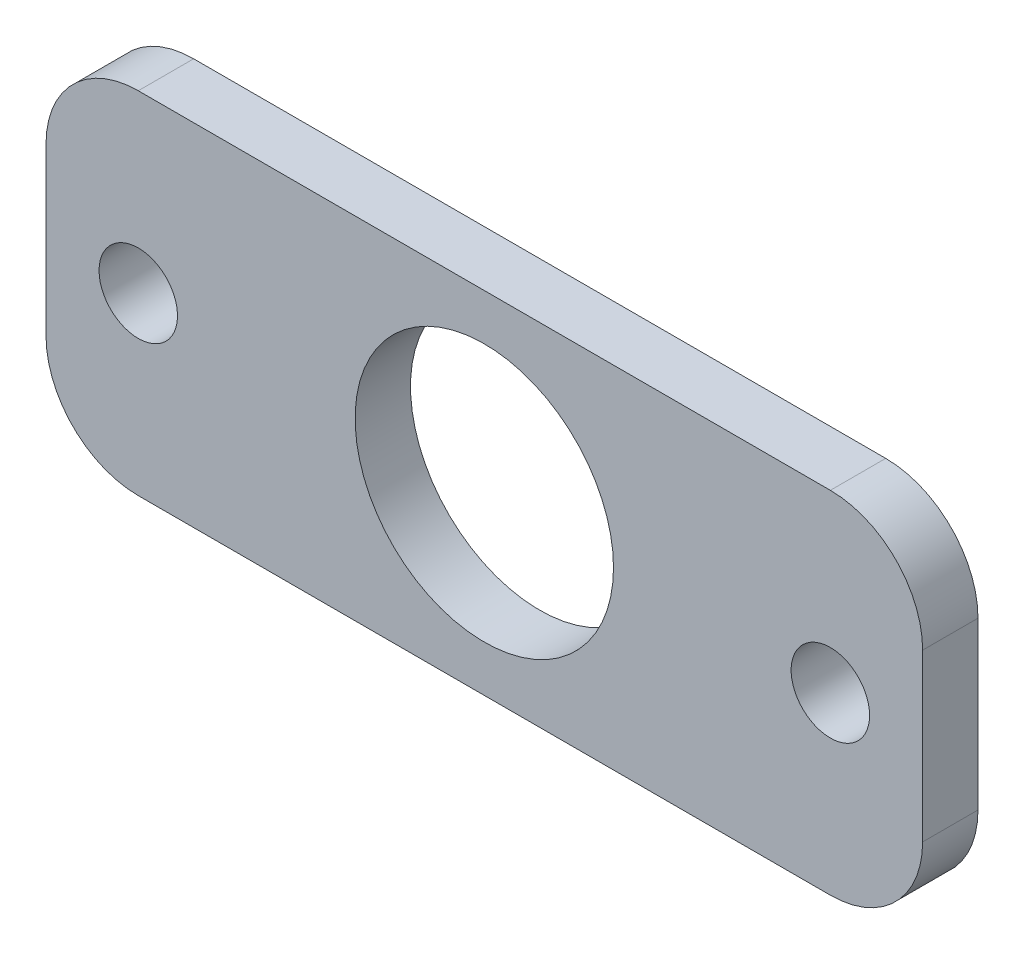
ISO-10303-21;
HEADER;
FILE_DESCRIPTION(('STEP AP214'),'2;1');
FILE_NAME('part.step','',(''),(''),'','','');
FILE_SCHEMA(('AUTOMOTIVE_DESIGN { 1 0 10303 214 1 1 1 1 }'));
ENDSEC;
DATA;
#1=APPLICATION_CONTEXT('core data for automotive mechanical design processes');
#2=APPLICATION_PROTOCOL_DEFINITION('international standard','automotive_design',2000,#1);
#3=PRODUCT_CONTEXT('',#1,'mechanical');
#4=PRODUCT('Part','Part','',(#3));
#5=PRODUCT_RELATED_PRODUCT_CATEGORY('part','',(#4));
#6=PRODUCT_DEFINITION_FORMATION('','',#4);
#7=PRODUCT_DEFINITION_CONTEXT('part definition',#1,'design');
#8=PRODUCT_DEFINITION('design','',#6,#7);
#9=PRODUCT_DEFINITION_SHAPE('','',#8);
#10=(LENGTH_UNIT() NAMED_UNIT(*) SI_UNIT(.MILLI.,.METRE.));
#11=(NAMED_UNIT(*) PLANE_ANGLE_UNIT() SI_UNIT($,.RADIAN.));
#12=(NAMED_UNIT(*) SI_UNIT($,.STERADIAN.) SOLID_ANGLE_UNIT());
#13=UNCERTAINTY_MEASURE_WITH_UNIT(LENGTH_MEASURE(1.E-05),#10,'distance_accuracy_value','');
#14=(GEOMETRIC_REPRESENTATION_CONTEXT(3) GLOBAL_UNCERTAINTY_ASSIGNED_CONTEXT((#13)) GLOBAL_UNIT_ASSIGNED_CONTEXT((#10,
#11,#12)) REPRESENTATION_CONTEXT('',''));
#15=CARTESIAN_POINT('',(0.,0.,0.));
#16=DIRECTION('',(0.,0.,1.));
#17=DIRECTION('',(1.,0.,0.));
#18=AXIS2_PLACEMENT_3D('',#15,#16,#17);
#19=CARTESIAN_POINT('',(0.,0.,6.));
#20=DIRECTION('',(0.,0.,-1.));
#21=DIRECTION('',(-1.,0.,0.));
#22=AXIS2_PLACEMENT_3D('',#19,#20,#21);
#23=PLANE('',#22);
#24=DIRECTION('',(0.,1.,0.));
#25=VECTOR('',#24,1.);
#26=CARTESIAN_POINT('',(399.,0.,6.));
#27=LINE('',#26,#25);
#28=CARTESIAN_POINT('',(399.,-28.,6.));
#29=VERTEX_POINT('',#28);
#30=CARTESIAN_POINT('',(399.,-9.99999999999998,6.));
#31=VERTEX_POINT('',#30);
#32=EDGE_CURVE('E148',#29,#31,#27,.T.);
#33=ORIENTED_EDGE('',*,*,#32,.T.);
#34=CARTESIAN_POINT('',(389.,-9.99999999999998,6.));
#35=DIRECTION('',(0.,0.,-1.));
#36=DIRECTION('',(-1.,0.,0.));
#37=AXIS2_PLACEMENT_3D('',#34,#35,#36);
#38=CIRCLE('',#37,10.);
#39=CARTESIAN_POINT('',(389.,0.,6.));
#40=VERTEX_POINT('',#39);
#41=EDGE_CURVE('E172',#31,#40,#38,.F.);
#42=ORIENTED_EDGE('',*,*,#41,.T.);
#43=DIRECTION('',(-1.,0.,0.));
#44=VECTOR('',#43,1.);
#45=CARTESIAN_POINT('',(399.,0.,6.));
#46=LINE('',#45,#44);
#47=CARTESIAN_POINT('',(314.,0.,6.));
#48=VERTEX_POINT('',#47);
#49=EDGE_CURVE('E124',#40,#48,#46,.T.);
#50=ORIENTED_EDGE('',*,*,#49,.T.);
#51=CARTESIAN_POINT('',(314.,-9.99999999999998,6.));
#52=DIRECTION('',(0.,0.,-1.));
#53=DIRECTION('',(-1.,0.,0.));
#54=AXIS2_PLACEMENT_3D('',#51,#52,#53);
#55=CIRCLE('',#54,10.);
#56=CARTESIAN_POINT('',(304.,-9.99999999999998,6.));
#57=VERTEX_POINT('',#56);
#58=EDGE_CURVE('E164',#48,#57,#55,.F.);
#59=ORIENTED_EDGE('',*,*,#58,.T.);
#60=DIRECTION('',(0.,-1.,0.));
#61=VECTOR('',#60,1.);
#62=CARTESIAN_POINT('',(304.,0.,6.));
#63=LINE('',#62,#61);
#64=CARTESIAN_POINT('',(304.,-28.,6.));
#65=VERTEX_POINT('',#64);
#66=EDGE_CURVE('E188',#57,#65,#63,.T.);
#67=ORIENTED_EDGE('',*,*,#66,.T.);
#68=CARTESIAN_POINT('',(314.,-28.,6.));
#69=DIRECTION('',(0.,0.,-1.));
#70=DIRECTION('',(-1.,0.,0.));
#71=AXIS2_PLACEMENT_3D('',#68,#69,#70);
#72=CIRCLE('',#71,10.);
#73=CARTESIAN_POINT('',(314.,-38.,6.));
#74=VERTEX_POINT('',#73);
#75=EDGE_CURVE('E59',#65,#74,#72,.F.);
#76=ORIENTED_EDGE('',*,*,#75,.T.);
#77=DIRECTION('',(1.,0.,0.));
#78=VECTOR('',#77,1.);
#79=CARTESIAN_POINT('',(399.,-38.,6.));
#80=LINE('',#79,#78);
#81=CARTESIAN_POINT('',(389.,-38.,6.));
#82=VERTEX_POINT('',#81);
#83=EDGE_CURVE('E150',#74,#82,#80,.T.);
#84=ORIENTED_EDGE('',*,*,#83,.T.);
#85=CARTESIAN_POINT('',(389.,-28.,6.));
#86=DIRECTION('',(0.,0.,-1.));
#87=DIRECTION('',(-1.,0.,0.));
#88=AXIS2_PLACEMENT_3D('',#85,#86,#87);
#89=CIRCLE('',#88,10.);
#90=EDGE_CURVE('E169',#82,#29,#89,.F.);
#91=ORIENTED_EDGE('',*,*,#90,.T.);
#92=EDGE_LOOP('',(#33,#42,#50,#59,#67,#76,#84,#91));
#93=FACE_BOUND('',#92,.T.);
#94=CARTESIAN_POINT('',(351.5,-19.,6.));
#95=DIRECTION('',(0.,0.,1.));
#96=DIRECTION('',(1.,0.,0.));
#97=AXIS2_PLACEMENT_3D('',#94,#95,#96);
#98=CIRCLE('',#97,14.);
#99=CARTESIAN_POINT('',(365.5,-19.,6.));
#100=VERTEX_POINT('',#99);
#101=EDGE_CURVE('E142',#100,#100,#98,.T.);
#102=ORIENTED_EDGE('',*,*,#101,.F.);
#103=EDGE_LOOP('',(#102));
#104=FACE_BOUND('',#103,.T.);
#105=CARTESIAN_POINT('',(389.,-19.,6.));
#106=DIRECTION('',(0.,0.,1.));
#107=DIRECTION('',(1.,0.,0.));
#108=AXIS2_PLACEMENT_3D('',#105,#106,#107);
#109=CIRCLE('',#108,4.24999999999995);
#110=CARTESIAN_POINT('',(393.25,-19.,6.));
#111=VERTEX_POINT('',#110);
#112=EDGE_CURVE('E209',#111,#111,#109,.T.);
#113=ORIENTED_EDGE('',*,*,#112,.F.);
#114=EDGE_LOOP('',(#113));
#115=FACE_BOUND('',#114,.T.);
#116=CARTESIAN_POINT('',(314.,-19.,6.));
#117=DIRECTION('',(0.,0.,1.));
#118=DIRECTION('',(-1.,0.,0.));
#119=AXIS2_PLACEMENT_3D('',#116,#117,#118);
#120=CIRCLE('',#119,4.24999999999995);
#121=CARTESIAN_POINT('',(309.75,-19.,6.));
#122=VERTEX_POINT('',#121);
#123=EDGE_CURVE('E217',#122,#122,#120,.T.);
#124=ORIENTED_EDGE('',*,*,#123,.F.);
#125=EDGE_LOOP('',(#124));
#126=FACE_BOUND('',#125,.T.);
#127=ADVANCED_FACE('F36',(#93,#104,#115,#126),#23,.F.);
#128=CARTESIAN_POINT('',(0.,0.,0.));
#129=DIRECTION('',(0.,0.,-1.));
#130=DIRECTION('',(-1.,0.,0.));
#131=AXIS2_PLACEMENT_3D('',#128,#129,#130);
#132=PLANE('',#131);
#133=CARTESIAN_POINT('',(389.,-19.,0.));
#134=DIRECTION('',(0.,0.,1.));
#135=DIRECTION('',(1.,0.,0.));
#136=AXIS2_PLACEMENT_3D('',#133,#134,#135);
#137=CIRCLE('',#136,4.24999999999995);
#138=CARTESIAN_POINT('',(393.25,-19.,0.));
#139=VERTEX_POINT('',#138);
#140=EDGE_CURVE('E213',#139,#139,#137,.T.);
#141=ORIENTED_EDGE('',*,*,#140,.T.);
#142=EDGE_LOOP('',(#141));
#143=FACE_BOUND('',#142,.T.);
#144=DIRECTION('',(-1.,0.,0.));
#145=VECTOR('',#144,1.);
#146=CARTESIAN_POINT('',(399.,0.,0.));
#147=LINE('',#146,#145);
#148=CARTESIAN_POINT('',(389.,0.,0.));
#149=VERTEX_POINT('',#148);
#150=CARTESIAN_POINT('',(314.,0.,0.));
#151=VERTEX_POINT('',#150);
#152=EDGE_CURVE('E121',#149,#151,#147,.T.);
#153=ORIENTED_EDGE('',*,*,#152,.F.);
#154=CARTESIAN_POINT('',(389.,-9.99999999999998,0.));
#155=DIRECTION('',(0.,0.,-1.));
#156=DIRECTION('',(-1.,0.,0.));
#157=AXIS2_PLACEMENT_3D('',#154,#155,#156);
#158=CIRCLE('',#157,10.);
#159=CARTESIAN_POINT('',(399.,-9.99999999999998,0.));
#160=VERTEX_POINT('',#159);
#161=EDGE_CURVE('E103',#149,#160,#158,.T.);
#162=ORIENTED_EDGE('',*,*,#161,.T.);
#163=DIRECTION('',(0.,1.,0.));
#164=VECTOR('',#163,1.);
#165=CARTESIAN_POINT('',(399.,0.,0.));
#166=LINE('',#165,#164);
#167=CARTESIAN_POINT('',(399.,-28.,0.));
#168=VERTEX_POINT('',#167);
#169=EDGE_CURVE('E134',#168,#160,#166,.T.);
#170=ORIENTED_EDGE('',*,*,#169,.F.);
#171=CARTESIAN_POINT('',(389.,-28.,0.));
#172=DIRECTION('',(0.,0.,-1.));
#173=DIRECTION('',(-1.,0.,0.));
#174=AXIS2_PLACEMENT_3D('',#171,#172,#173);
#175=CIRCLE('',#174,10.);
#176=CARTESIAN_POINT('',(389.,-38.,0.));
#177=VERTEX_POINT('',#176);
#178=EDGE_CURVE('E115',#168,#177,#175,.T.);
#179=ORIENTED_EDGE('',*,*,#178,.T.);
#180=DIRECTION('',(1.,0.,0.));
#181=VECTOR('',#180,1.);
#182=CARTESIAN_POINT('',(399.,-38.,0.));
#183=LINE('',#182,#181);
#184=CARTESIAN_POINT('',(314.,-38.,0.));
#185=VERTEX_POINT('',#184);
#186=EDGE_CURVE('E140',#185,#177,#183,.T.);
#187=ORIENTED_EDGE('',*,*,#186,.F.);
#188=CARTESIAN_POINT('',(314.,-28.,0.));
#189=DIRECTION('',(0.,0.,-1.));
#190=DIRECTION('',(-1.,0.,0.));
#191=AXIS2_PLACEMENT_3D('',#188,#189,#190);
#192=CIRCLE('',#191,10.);
#193=CARTESIAN_POINT('',(304.,-28.,0.));
#194=VERTEX_POINT('',#193);
#195=EDGE_CURVE('E154',#185,#194,#192,.T.);
#196=ORIENTED_EDGE('',*,*,#195,.T.);
#197=DIRECTION('',(0.,-1.,0.));
#198=VECTOR('',#197,1.);
#199=CARTESIAN_POINT('',(304.,0.,0.));
#200=LINE('',#199,#198);
#201=CARTESIAN_POINT('',(304.,-9.99999999999998,0.));
#202=VERTEX_POINT('',#201);
#203=EDGE_CURVE('E133',#202,#194,#200,.T.);
#204=ORIENTED_EDGE('',*,*,#203,.F.);
#205=CARTESIAN_POINT('',(314.,-9.99999999999998,0.));
#206=DIRECTION('',(0.,0.,-1.));
#207=DIRECTION('',(-1.,0.,0.));
#208=AXIS2_PLACEMENT_3D('',#205,#206,#207);
#209=CIRCLE('',#208,10.);
#210=EDGE_CURVE('E126',#202,#151,#209,.T.);
#211=ORIENTED_EDGE('',*,*,#210,.T.);
#212=EDGE_LOOP('',(#153,#162,#170,#179,#187,#196,#204,#211));
#213=FACE_BOUND('',#212,.T.);
#214=CARTESIAN_POINT('',(351.5,-19.,0.));
#215=DIRECTION('',(0.,0.,1.));
#216=DIRECTION('',(1.,0.,0.));
#217=AXIS2_PLACEMENT_3D('',#214,#215,#216);
#218=CIRCLE('',#217,14.);
#219=CARTESIAN_POINT('',(365.5,-19.,0.));
#220=VERTEX_POINT('',#219);
#221=EDGE_CURVE('E205',#220,#220,#218,.T.);
#222=ORIENTED_EDGE('',*,*,#221,.T.);
#223=EDGE_LOOP('',(#222));
#224=FACE_BOUND('',#223,.T.);
#225=CARTESIAN_POINT('',(314.,-19.,0.));
#226=DIRECTION('',(0.,0.,1.));
#227=DIRECTION('',(-1.,0.,0.));
#228=AXIS2_PLACEMENT_3D('',#225,#226,#227);
#229=CIRCLE('',#228,4.24999999999995);
#230=CARTESIAN_POINT('',(309.75,-19.,0.));
#231=VERTEX_POINT('',#230);
#232=EDGE_CURVE('E220',#231,#231,#229,.T.);
#233=ORIENTED_EDGE('',*,*,#232,.T.);
#234=EDGE_LOOP('',(#233));
#235=FACE_BOUND('',#234,.T.);
#236=ADVANCED_FACE('F129',(#143,#213,#224,#235),#132,.T.);
#237=CARTESIAN_POINT('',(399.,0.,6.));
#238=DIRECTION('',(-1.,0.,0.));
#239=DIRECTION('',(0.,0.,1.));
#240=AXIS2_PLACEMENT_3D('',#237,#238,#239);
#241=PLANE('',#240);
#242=ORIENTED_EDGE('',*,*,#169,.T.);
#243=DIRECTION('',(0.,0.,-1.));
#244=VECTOR('',#243,1.);
#245=CARTESIAN_POINT('',(399.,-9.99999999999998,6.));
#246=LINE('',#245,#244);
#247=EDGE_CURVE('E108',#160,#31,#246,.F.);
#248=ORIENTED_EDGE('',*,*,#247,.T.);
#249=ORIENTED_EDGE('',*,*,#32,.F.);
#250=DIRECTION('',(0.,0.,-1.));
#251=VECTOR('',#250,1.);
#252=CARTESIAN_POINT('',(399.,-28.,6.));
#253=LINE('',#252,#251);
#254=EDGE_CURVE('E114',#29,#168,#253,.T.);
#255=ORIENTED_EDGE('',*,*,#254,.T.);
#256=EDGE_LOOP('',(#242,#248,#249,#255));
#257=FACE_BOUND('',#256,.T.);
#258=ADVANCED_FACE('F236',(#257),#241,.F.);
#259=CARTESIAN_POINT('',(399.,0.,6.));
#260=DIRECTION('',(0.,-1.,0.));
#261=DIRECTION('',(1.,0.,0.));
#262=AXIS2_PLACEMENT_3D('',#259,#260,#261);
#263=PLANE('',#262);
#264=ORIENTED_EDGE('',*,*,#49,.F.);
#265=DIRECTION('',(0.,0.,-1.));
#266=VECTOR('',#265,1.);
#267=CARTESIAN_POINT('',(389.,0.,6.));
#268=LINE('',#267,#266);
#269=EDGE_CURVE('E107',#40,#149,#268,.T.);
#270=ORIENTED_EDGE('',*,*,#269,.T.);
#271=ORIENTED_EDGE('',*,*,#152,.T.);
#272=DIRECTION('',(0.,0.,-1.));
#273=VECTOR('',#272,1.);
#274=CARTESIAN_POINT('',(314.,0.,6.));
#275=LINE('',#274,#273);
#276=EDGE_CURVE('E127',#151,#48,#275,.F.);
#277=ORIENTED_EDGE('',*,*,#276,.T.);
#278=EDGE_LOOP('',(#264,#270,#271,#277));
#279=FACE_BOUND('',#278,.T.);
#280=ADVANCED_FACE('F120',(#279),#263,.F.);
#281=CARTESIAN_POINT('',(304.,0.,6.));
#282=DIRECTION('',(1.,0.,0.));
#283=DIRECTION('',(0.,0.,-1.));
#284=AXIS2_PLACEMENT_3D('',#281,#282,#283);
#285=PLANE('',#284);
#286=ORIENTED_EDGE('',*,*,#203,.T.);
#287=DIRECTION('',(0.,0.,-1.));
#288=VECTOR('',#287,1.);
#289=CARTESIAN_POINT('',(304.,-28.,6.));
#290=LINE('',#289,#288);
#291=EDGE_CURVE('E11',#194,#65,#290,.F.);
#292=ORIENTED_EDGE('',*,*,#291,.T.);
#293=ORIENTED_EDGE('',*,*,#66,.F.);
#294=DIRECTION('',(0.,0.,-1.));
#295=VECTOR('',#294,1.);
#296=CARTESIAN_POINT('',(304.,-9.99999999999998,6.));
#297=LINE('',#296,#295);
#298=EDGE_CURVE('E45',#57,#202,#297,.T.);
#299=ORIENTED_EDGE('',*,*,#298,.T.);
#300=EDGE_LOOP('',(#286,#292,#293,#299));
#301=FACE_BOUND('',#300,.T.);
#302=ADVANCED_FACE('F186',(#301),#285,.F.);
#303=CARTESIAN_POINT('',(399.,-38.,6.));
#304=DIRECTION('',(0.,1.,0.));
#305=DIRECTION('',(-1.,0.,0.));
#306=AXIS2_PLACEMENT_3D('',#303,#304,#305);
#307=PLANE('',#306);
#308=ORIENTED_EDGE('',*,*,#186,.T.);
#309=DIRECTION('',(0.,0.,-1.));
#310=VECTOR('',#309,1.);
#311=CARTESIAN_POINT('',(389.,-38.,6.));
#312=LINE('',#311,#310);
#313=EDGE_CURVE('E52',#177,#82,#312,.F.);
#314=ORIENTED_EDGE('',*,*,#313,.T.);
#315=ORIENTED_EDGE('',*,*,#83,.F.);
#316=DIRECTION('',(0.,0.,-1.));
#317=VECTOR('',#316,1.);
#318=CARTESIAN_POINT('',(314.,-38.,6.));
#319=LINE('',#318,#317);
#320=EDGE_CURVE('E175',#74,#185,#319,.T.);
#321=ORIENTED_EDGE('',*,*,#320,.T.);
#322=EDGE_LOOP('',(#308,#314,#315,#321));
#323=FACE_BOUND('',#322,.T.);
#324=ADVANCED_FACE('F195',(#323),#307,.F.);
#325=CARTESIAN_POINT('',(351.5,-19.,6.));
#326=DIRECTION('',(0.,0.,-1.));
#327=DIRECTION('',(-1.,0.,0.));
#328=AXIS2_PLACEMENT_3D('',#325,#326,#327);
#329=CYLINDRICAL_SURFACE('',#328,14.);
#330=ORIENTED_EDGE('',*,*,#101,.T.);
#331=EDGE_LOOP('',(#330));
#332=FACE_BOUND('',#331,.T.);
#333=ORIENTED_EDGE('',*,*,#221,.F.);
#334=EDGE_LOOP('',(#333));
#335=FACE_BOUND('',#334,.T.);
#336=ADVANCED_FACE('F241',(#332,#335),#329,.F.);
#337=CARTESIAN_POINT('',(389.,-19.,6.));
#338=DIRECTION('',(0.,0.,-1.));
#339=DIRECTION('',(-1.,0.,0.));
#340=AXIS2_PLACEMENT_3D('',#337,#338,#339);
#341=CYLINDRICAL_SURFACE('',#340,4.24999999999995);
#342=ORIENTED_EDGE('',*,*,#112,.T.);
#343=EDGE_LOOP('',(#342));
#344=FACE_BOUND('',#343,.T.);
#345=ORIENTED_EDGE('',*,*,#140,.F.);
#346=EDGE_LOOP('',(#345));
#347=FACE_BOUND('',#346,.T.);
#348=ADVANCED_FACE('F287',(#344,#347),#341,.F.);
#349=CARTESIAN_POINT('',(314.,-19.,6.));
#350=DIRECTION('',(0.,0.,-1.));
#351=DIRECTION('',(-1.,0.,0.));
#352=AXIS2_PLACEMENT_3D('',#349,#350,#351);
#353=CYLINDRICAL_SURFACE('',#352,4.24999999999995);
#354=ORIENTED_EDGE('',*,*,#123,.T.);
#355=EDGE_LOOP('',(#354));
#356=FACE_BOUND('',#355,.T.);
#357=ORIENTED_EDGE('',*,*,#232,.F.);
#358=EDGE_LOOP('',(#357));
#359=FACE_BOUND('',#358,.T.);
#360=ADVANCED_FACE('F228',(#356,#359),#353,.F.);
#361=CARTESIAN_POINT('',(389.,-9.99999999999998,6.));
#362=DIRECTION('',(0.,0.,-1.));
#363=DIRECTION('',(-1.,0.,0.));
#364=AXIS2_PLACEMENT_3D('',#361,#362,#363);
#365=CYLINDRICAL_SURFACE('',#364,10.);
#366=ORIENTED_EDGE('',*,*,#41,.F.);
#367=ORIENTED_EDGE('',*,*,#247,.F.);
#368=ORIENTED_EDGE('',*,*,#161,.F.);
#369=ORIENTED_EDGE('',*,*,#269,.F.);
#370=EDGE_LOOP('',(#366,#367,#368,#369));
#371=FACE_BOUND('',#370,.T.);
#372=ADVANCED_FACE('F106',(#371),#365,.T.);
#373=CARTESIAN_POINT('',(389.,-28.,6.));
#374=DIRECTION('',(0.,0.,-1.));
#375=DIRECTION('',(-1.,0.,0.));
#376=AXIS2_PLACEMENT_3D('',#373,#374,#375);
#377=CYLINDRICAL_SURFACE('',#376,10.);
#378=ORIENTED_EDGE('',*,*,#90,.F.);
#379=ORIENTED_EDGE('',*,*,#313,.F.);
#380=ORIENTED_EDGE('',*,*,#178,.F.);
#381=ORIENTED_EDGE('',*,*,#254,.F.);
#382=EDGE_LOOP('',(#378,#379,#380,#381));
#383=FACE_BOUND('',#382,.T.);
#384=ADVANCED_FACE('F255',(#383),#377,.T.);
#385=CARTESIAN_POINT('',(314.,-28.,6.));
#386=DIRECTION('',(0.,0.,-1.));
#387=DIRECTION('',(-1.,0.,0.));
#388=AXIS2_PLACEMENT_3D('',#385,#386,#387);
#389=CYLINDRICAL_SURFACE('',#388,10.);
#390=ORIENTED_EDGE('',*,*,#75,.F.);
#391=ORIENTED_EDGE('',*,*,#291,.F.);
#392=ORIENTED_EDGE('',*,*,#195,.F.);
#393=ORIENTED_EDGE('',*,*,#320,.F.);
#394=EDGE_LOOP('',(#390,#391,#392,#393));
#395=FACE_BOUND('',#394,.T.);
#396=ADVANCED_FACE('F194',(#395),#389,.T.);
#397=CARTESIAN_POINT('',(314.,-9.99999999999998,6.));
#398=DIRECTION('',(0.,0.,-1.));
#399=DIRECTION('',(-1.,0.,0.));
#400=AXIS2_PLACEMENT_3D('',#397,#398,#399);
#401=CYLINDRICAL_SURFACE('',#400,10.);
#402=ORIENTED_EDGE('',*,*,#58,.F.);
#403=ORIENTED_EDGE('',*,*,#276,.F.);
#404=ORIENTED_EDGE('',*,*,#210,.F.);
#405=ORIENTED_EDGE('',*,*,#298,.F.);
#406=EDGE_LOOP('',(#402,#403,#404,#405));
#407=FACE_BOUND('',#406,.T.);
#408=ADVANCED_FACE('F38',(#407),#401,.T.);
#409=CLOSED_SHELL('',(#127,#236,#258,#280,#302,#324,#336,#348,#360,#372,#384,#396,#408));
#410=MANIFOLD_SOLID_BREP('B2',#409);
#411=ADVANCED_BREP_SHAPE_REPRESENTATION('',(#18,#410),#14);
#412=SHAPE_DEFINITION_REPRESENTATION(#9,#411);
ENDSEC;
END-ISO-10303-21;
